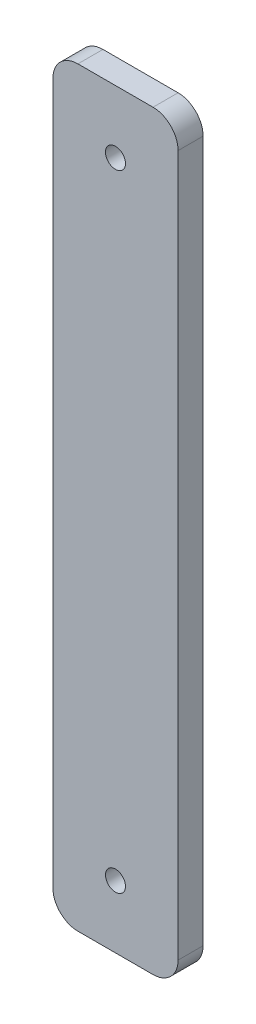
ISO-10303-21;
HEADER;
FILE_DESCRIPTION(('STEP AP214'),'2;1');
FILE_NAME('part.step','',(''),(''),'','','');
FILE_SCHEMA(('AUTOMOTIVE_DESIGN { 1 0 10303 214 1 1 1 1 }'));
ENDSEC;
DATA;
#1=APPLICATION_CONTEXT('core data for automotive mechanical design processes');
#2=APPLICATION_PROTOCOL_DEFINITION('international standard','automotive_design',2000,#1);
#3=PRODUCT_CONTEXT('',#1,'mechanical');
#4=PRODUCT('Part','Part','',(#3));
#5=PRODUCT_RELATED_PRODUCT_CATEGORY('part','',(#4));
#6=PRODUCT_DEFINITION_FORMATION('','',#4);
#7=PRODUCT_DEFINITION_CONTEXT('part definition',#1,'design');
#8=PRODUCT_DEFINITION('design','',#6,#7);
#9=PRODUCT_DEFINITION_SHAPE('','',#8);
#10=(LENGTH_UNIT() NAMED_UNIT(*) SI_UNIT(.MILLI.,.METRE.));
#11=(NAMED_UNIT(*) PLANE_ANGLE_UNIT() SI_UNIT($,.RADIAN.));
#12=(NAMED_UNIT(*) SI_UNIT($,.STERADIAN.) SOLID_ANGLE_UNIT());
#13=UNCERTAINTY_MEASURE_WITH_UNIT(LENGTH_MEASURE(1.E-05),#10,'distance_accuracy_value','');
#14=(GEOMETRIC_REPRESENTATION_CONTEXT(3) GLOBAL_UNCERTAINTY_ASSIGNED_CONTEXT((#13)) GLOBAL_UNIT_ASSIGNED_CONTEXT((#10,
#11,#12)) REPRESENTATION_CONTEXT('',''));
#15=CARTESIAN_POINT('',(0.,0.,0.));
#16=DIRECTION('',(0.,0.,1.));
#17=DIRECTION('',(1.,0.,0.));
#18=AXIS2_PLACEMENT_3D('',#15,#16,#17);
#19=CARTESIAN_POINT('',(0.,0.,10.));
#20=DIRECTION('',(0.,0.,1.));
#21=DIRECTION('',(1.,0.,0.));
#22=AXIS2_PLACEMENT_3D('',#19,#20,#21);
#23=PLANE('',#22);
#24=CARTESIAN_POINT('',(25.,-275.,10.));
#25=DIRECTION('',(0.,0.,1.));
#26=DIRECTION('',(1.,0.,0.));
#27=AXIS2_PLACEMENT_3D('',#24,#25,#26);
#28=CIRCLE('',#27,4.);
#29=CARTESIAN_POINT('',(29.,-275.,10.));
#30=VERTEX_POINT('',#29);
#31=EDGE_CURVE('E178',#30,#30,#28,.T.);
#32=ORIENTED_EDGE('',*,*,#31,.F.);
#33=EDGE_LOOP('',(#32));
#34=FACE_BOUND('',#33,.T.);
#35=DIRECTION('',(1.,0.,0.));
#36=VECTOR('',#35,1.);
#37=CARTESIAN_POINT('',(0.,-300.,10.));
#38=LINE('',#37,#36);
#39=CARTESIAN_POINT('',(10.,-300.,10.));
#40=VERTEX_POINT('',#39);
#41=CARTESIAN_POINT('',(40.,-300.,10.));
#42=VERTEX_POINT('',#41);
#43=EDGE_CURVE('E169',#40,#42,#38,.T.);
#44=ORIENTED_EDGE('',*,*,#43,.T.);
#45=CARTESIAN_POINT('',(40.,-290.,10.));
#46=DIRECTION('',(0.,0.,1.));
#47=DIRECTION('',(1.,0.,0.));
#48=AXIS2_PLACEMENT_3D('',#45,#46,#47);
#49=CIRCLE('',#48,10.);
#50=CARTESIAN_POINT('',(50.,-290.,10.));
#51=VERTEX_POINT('',#50);
#52=EDGE_CURVE('E147',#42,#51,#49,.T.);
#53=ORIENTED_EDGE('',*,*,#52,.T.);
#54=DIRECTION('',(0.,1.,0.));
#55=VECTOR('',#54,1.);
#56=CARTESIAN_POINT('',(50.,0.,10.));
#57=LINE('',#56,#55);
#58=CARTESIAN_POINT('',(50.,-10.,10.));
#59=VERTEX_POINT('',#58);
#60=EDGE_CURVE('E117',#51,#59,#57,.T.);
#61=ORIENTED_EDGE('',*,*,#60,.T.);
#62=CARTESIAN_POINT('',(40.,-10.,10.));
#63=DIRECTION('',(0.,0.,1.));
#64=DIRECTION('',(1.,0.,0.));
#65=AXIS2_PLACEMENT_3D('',#62,#63,#64);
#66=CIRCLE('',#65,10.);
#67=CARTESIAN_POINT('',(40.,0.,10.));
#68=VERTEX_POINT('',#67);
#69=EDGE_CURVE('E53',#59,#68,#66,.T.);
#70=ORIENTED_EDGE('',*,*,#69,.T.);
#71=DIRECTION('',(-1.,0.,0.));
#72=VECTOR('',#71,1.);
#73=CARTESIAN_POINT('',(0.,0.,10.));
#74=LINE('',#73,#72);
#75=CARTESIAN_POINT('',(10.,0.,10.));
#76=VERTEX_POINT('',#75);
#77=EDGE_CURVE('E133',#68,#76,#74,.T.);
#78=ORIENTED_EDGE('',*,*,#77,.T.);
#79=CARTESIAN_POINT('',(10.,-10.,10.));
#80=DIRECTION('',(0.,0.,1.));
#81=DIRECTION('',(1.,0.,0.));
#82=AXIS2_PLACEMENT_3D('',#79,#80,#81);
#83=CIRCLE('',#82,10.);
#84=CARTESIAN_POINT('',(0.,-10.,10.));
#85=VERTEX_POINT('',#84);
#86=EDGE_CURVE('E143',#76,#85,#83,.T.);
#87=ORIENTED_EDGE('',*,*,#86,.T.);
#88=DIRECTION('',(0.,-1.,0.));
#89=VECTOR('',#88,1.);
#90=CARTESIAN_POINT('',(0.,0.,10.));
#91=LINE('',#90,#89);
#92=CARTESIAN_POINT('',(0.,-290.,10.));
#93=VERTEX_POINT('',#92);
#94=EDGE_CURVE('E127',#85,#93,#91,.T.);
#95=ORIENTED_EDGE('',*,*,#94,.T.);
#96=CARTESIAN_POINT('',(10.,-290.,10.));
#97=DIRECTION('',(0.,0.,1.));
#98=DIRECTION('',(1.,0.,0.));
#99=AXIS2_PLACEMENT_3D('',#96,#97,#98);
#100=CIRCLE('',#99,10.);
#101=EDGE_CURVE('E145',#93,#40,#100,.T.);
#102=ORIENTED_EDGE('',*,*,#101,.T.);
#103=EDGE_LOOP('',(#44,#53,#61,#70,#78,#87,#95,#102));
#104=FACE_BOUND('',#103,.T.);
#105=CARTESIAN_POINT('',(25.0000000000001,-25.,10.));
#106=DIRECTION('',(0.,0.,1.));
#107=DIRECTION('',(-1.,0.,0.));
#108=AXIS2_PLACEMENT_3D('',#105,#106,#107);
#109=CIRCLE('',#108,4.);
#110=CARTESIAN_POINT('',(21.0000000000001,-25.,10.));
#111=VERTEX_POINT('',#110);
#112=EDGE_CURVE('E183',#111,#111,#109,.T.);
#113=ORIENTED_EDGE('',*,*,#112,.F.);
#114=EDGE_LOOP('',(#113));
#115=FACE_BOUND('',#114,.T.);
#116=ADVANCED_FACE('F33',(#34,#104,#115),#23,.T.);
#117=CARTESIAN_POINT('',(0.,0.,0.));
#118=DIRECTION('',(0.,0.,1.));
#119=DIRECTION('',(1.,0.,0.));
#120=AXIS2_PLACEMENT_3D('',#117,#118,#119);
#121=PLANE('',#120);
#122=DIRECTION('',(0.,1.,0.));
#123=VECTOR('',#122,1.);
#124=CARTESIAN_POINT('',(50.,0.,0.));
#125=LINE('',#124,#123);
#126=CARTESIAN_POINT('',(50.,-290.,0.));
#127=VERTEX_POINT('',#126);
#128=CARTESIAN_POINT('',(50.,-10.,0.));
#129=VERTEX_POINT('',#128);
#130=EDGE_CURVE('E115',#127,#129,#125,.T.);
#131=ORIENTED_EDGE('',*,*,#130,.F.);
#132=CARTESIAN_POINT('',(40.,-290.,0.));
#133=DIRECTION('',(0.,0.,1.));
#134=DIRECTION('',(1.,0.,0.));
#135=AXIS2_PLACEMENT_3D('',#132,#133,#134);
#136=CIRCLE('',#135,10.);
#137=CARTESIAN_POINT('',(40.,-300.,0.));
#138=VERTEX_POINT('',#137);
#139=EDGE_CURVE('E98',#127,#138,#136,.F.);
#140=ORIENTED_EDGE('',*,*,#139,.T.);
#141=DIRECTION('',(1.,0.,0.));
#142=VECTOR('',#141,1.);
#143=CARTESIAN_POINT('',(0.,-300.,0.));
#144=LINE('',#143,#142);
#145=CARTESIAN_POINT('',(10.,-300.,0.));
#146=VERTEX_POINT('',#145);
#147=EDGE_CURVE('E125',#146,#138,#144,.T.);
#148=ORIENTED_EDGE('',*,*,#147,.F.);
#149=CARTESIAN_POINT('',(10.,-290.,0.));
#150=DIRECTION('',(0.,0.,1.));
#151=DIRECTION('',(1.,0.,0.));
#152=AXIS2_PLACEMENT_3D('',#149,#150,#151);
#153=CIRCLE('',#152,10.);
#154=CARTESIAN_POINT('',(0.,-290.,0.));
#155=VERTEX_POINT('',#154);
#156=EDGE_CURVE('E109',#146,#155,#153,.F.);
#157=ORIENTED_EDGE('',*,*,#156,.T.);
#158=DIRECTION('',(0.,-1.,0.));
#159=VECTOR('',#158,1.);
#160=CARTESIAN_POINT('',(0.,0.,0.));
#161=LINE('',#160,#159);
#162=CARTESIAN_POINT('',(0.,-10.,0.));
#163=VERTEX_POINT('',#162);
#164=EDGE_CURVE('E129',#163,#155,#161,.T.);
#165=ORIENTED_EDGE('',*,*,#164,.F.);
#166=CARTESIAN_POINT('',(10.,-10.,0.));
#167=DIRECTION('',(0.,0.,1.));
#168=DIRECTION('',(1.,0.,0.));
#169=AXIS2_PLACEMENT_3D('',#166,#167,#168);
#170=CIRCLE('',#169,10.);
#171=CARTESIAN_POINT('',(10.,0.,0.));
#172=VERTEX_POINT('',#171);
#173=EDGE_CURVE('E136',#163,#172,#170,.F.);
#174=ORIENTED_EDGE('',*,*,#173,.T.);
#175=DIRECTION('',(-1.,0.,0.));
#176=VECTOR('',#175,1.);
#177=CARTESIAN_POINT('',(0.,0.,0.));
#178=LINE('',#177,#176);
#179=CARTESIAN_POINT('',(40.,0.,0.));
#180=VERTEX_POINT('',#179);
#181=EDGE_CURVE('E124',#180,#172,#178,.T.);
#182=ORIENTED_EDGE('',*,*,#181,.F.);
#183=CARTESIAN_POINT('',(40.,-10.,0.));
#184=DIRECTION('',(0.,0.,1.));
#185=DIRECTION('',(1.,0.,0.));
#186=AXIS2_PLACEMENT_3D('',#183,#184,#185);
#187=CIRCLE('',#186,10.);
#188=EDGE_CURVE('E118',#180,#129,#187,.F.);
#189=ORIENTED_EDGE('',*,*,#188,.T.);
#190=EDGE_LOOP('',(#131,#140,#148,#157,#165,#174,#182,#189));
#191=FACE_BOUND('',#190,.T.);
#192=CARTESIAN_POINT('',(25.,-275.,0.));
#193=DIRECTION('',(0.,0.,1.));
#194=DIRECTION('',(1.,0.,0.));
#195=AXIS2_PLACEMENT_3D('',#192,#193,#194);
#196=CIRCLE('',#195,4.);
#197=CARTESIAN_POINT('',(29.,-275.,0.));
#198=VERTEX_POINT('',#197);
#199=EDGE_CURVE('E174',#198,#198,#196,.T.);
#200=ORIENTED_EDGE('',*,*,#199,.T.);
#201=EDGE_LOOP('',(#200));
#202=FACE_BOUND('',#201,.T.);
#203=CARTESIAN_POINT('',(25.0000000000001,-25.,0.));
#204=DIRECTION('',(0.,0.,1.));
#205=DIRECTION('',(-1.,0.,0.));
#206=AXIS2_PLACEMENT_3D('',#203,#204,#205);
#207=CIRCLE('',#206,4.);
#208=CARTESIAN_POINT('',(21.0000000000001,-25.,0.));
#209=VERTEX_POINT('',#208);
#210=EDGE_CURVE('E185',#209,#209,#207,.T.);
#211=ORIENTED_EDGE('',*,*,#210,.T.);
#212=EDGE_LOOP('',(#211));
#213=FACE_BOUND('',#212,.T.);
#214=ADVANCED_FACE('F121',(#191,#202,#213),#121,.F.);
#215=CARTESIAN_POINT('',(0.,0.,10.));
#216=DIRECTION('',(1.,0.,0.));
#217=DIRECTION('',(0.,0.,-1.));
#218=AXIS2_PLACEMENT_3D('',#215,#216,#217);
#219=PLANE('',#218);
#220=ORIENTED_EDGE('',*,*,#164,.T.);
#221=DIRECTION('',(0.,0.,-1.));
#222=VECTOR('',#221,1.);
#223=CARTESIAN_POINT('',(0.,-290.,10.));
#224=LINE('',#223,#222);
#225=EDGE_CURVE('E152',#155,#93,#224,.F.);
#226=ORIENTED_EDGE('',*,*,#225,.T.);
#227=ORIENTED_EDGE('',*,*,#94,.F.);
#228=DIRECTION('',(0.,0.,-1.));
#229=VECTOR('',#228,1.);
#230=CARTESIAN_POINT('',(0.,-10.,10.));
#231=LINE('',#230,#229);
#232=EDGE_CURVE('E149',#85,#163,#231,.T.);
#233=ORIENTED_EDGE('',*,*,#232,.T.);
#234=EDGE_LOOP('',(#220,#226,#227,#233));
#235=FACE_BOUND('',#234,.T.);
#236=ADVANCED_FACE('F165',(#235),#219,.F.);
#237=CARTESIAN_POINT('',(0.,-300.,10.));
#238=DIRECTION('',(0.,1.,0.));
#239=DIRECTION('',(0.,0.,1.));
#240=AXIS2_PLACEMENT_3D('',#237,#238,#239);
#241=PLANE('',#240);
#242=ORIENTED_EDGE('',*,*,#147,.T.);
#243=DIRECTION('',(0.,0.,-1.));
#244=VECTOR('',#243,1.);
#245=CARTESIAN_POINT('',(40.,-300.,10.));
#246=LINE('',#245,#244);
#247=EDGE_CURVE('E103',#138,#42,#246,.F.);
#248=ORIENTED_EDGE('',*,*,#247,.T.);
#249=ORIENTED_EDGE('',*,*,#43,.F.);
#250=DIRECTION('',(0.,0.,-1.));
#251=VECTOR('',#250,1.);
#252=CARTESIAN_POINT('',(10.,-300.,10.));
#253=LINE('',#252,#251);
#254=EDGE_CURVE('E108',#40,#146,#253,.T.);
#255=ORIENTED_EDGE('',*,*,#254,.T.);
#256=EDGE_LOOP('',(#242,#248,#249,#255));
#257=FACE_BOUND('',#256,.T.);
#258=ADVANCED_FACE('F209',(#257),#241,.F.);
#259=CARTESIAN_POINT('',(50.,0.,10.));
#260=DIRECTION('',(-1.,0.,0.));
#261=DIRECTION('',(0.,0.,1.));
#262=AXIS2_PLACEMENT_3D('',#259,#260,#261);
#263=PLANE('',#262);
#264=ORIENTED_EDGE('',*,*,#60,.F.);
#265=DIRECTION('',(0.,0.,-1.));
#266=VECTOR('',#265,1.);
#267=CARTESIAN_POINT('',(50.,-290.,10.));
#268=LINE('',#267,#266);
#269=EDGE_CURVE('E102',#51,#127,#268,.T.);
#270=ORIENTED_EDGE('',*,*,#269,.T.);
#271=ORIENTED_EDGE('',*,*,#130,.T.);
#272=DIRECTION('',(0.,0.,-1.));
#273=VECTOR('',#272,1.);
#274=CARTESIAN_POINT('',(50.,-10.,10.));
#275=LINE('',#274,#273);
#276=EDGE_CURVE('E119',#129,#59,#275,.F.);
#277=ORIENTED_EDGE('',*,*,#276,.T.);
#278=EDGE_LOOP('',(#264,#270,#271,#277));
#279=FACE_BOUND('',#278,.T.);
#280=ADVANCED_FACE('F114',(#279),#263,.F.);
#281=CARTESIAN_POINT('',(0.,0.,10.));
#282=DIRECTION('',(0.,-1.,0.));
#283=DIRECTION('',(0.,0.,-1.));
#284=AXIS2_PLACEMENT_3D('',#281,#282,#283);
#285=PLANE('',#284);
#286=ORIENTED_EDGE('',*,*,#181,.T.);
#287=DIRECTION('',(0.,0.,-1.));
#288=VECTOR('',#287,1.);
#289=CARTESIAN_POINT('',(10.,0.,10.));
#290=LINE('',#289,#288);
#291=EDGE_CURVE('E11',#172,#76,#290,.F.);
#292=ORIENTED_EDGE('',*,*,#291,.T.);
#293=ORIENTED_EDGE('',*,*,#77,.F.);
#294=DIRECTION('',(0.,0.,-1.));
#295=VECTOR('',#294,1.);
#296=CARTESIAN_POINT('',(40.,0.,10.));
#297=LINE('',#296,#295);
#298=EDGE_CURVE('E41',#68,#180,#297,.T.);
#299=ORIENTED_EDGE('',*,*,#298,.T.);
#300=EDGE_LOOP('',(#286,#292,#293,#299));
#301=FACE_BOUND('',#300,.T.);
#302=ADVANCED_FACE('F155',(#301),#285,.F.);
#303=CARTESIAN_POINT('',(25.,-275.,10.));
#304=DIRECTION('',(0.,0.,-1.));
#305=DIRECTION('',(-1.,0.,0.));
#306=AXIS2_PLACEMENT_3D('',#303,#304,#305);
#307=CYLINDRICAL_SURFACE('',#306,4.);
#308=ORIENTED_EDGE('',*,*,#31,.T.);
#309=EDGE_LOOP('',(#308));
#310=FACE_BOUND('',#309,.T.);
#311=ORIENTED_EDGE('',*,*,#199,.F.);
#312=EDGE_LOOP('',(#311));
#313=FACE_BOUND('',#312,.T.);
#314=ADVANCED_FACE('F202',(#310,#313),#307,.F.);
#315=CARTESIAN_POINT('',(25.0000000000001,-25.,10.));
#316=DIRECTION('',(0.,0.,-1.));
#317=DIRECTION('',(-1.,0.,0.));
#318=AXIS2_PLACEMENT_3D('',#315,#316,#317);
#319=CYLINDRICAL_SURFACE('',#318,4.);
#320=ORIENTED_EDGE('',*,*,#112,.T.);
#321=EDGE_LOOP('',(#320));
#322=FACE_BOUND('',#321,.T.);
#323=ORIENTED_EDGE('',*,*,#210,.F.);
#324=EDGE_LOOP('',(#323));
#325=FACE_BOUND('',#324,.T.);
#326=ADVANCED_FACE('F191',(#322,#325),#319,.F.);
#327=CARTESIAN_POINT('',(40.,-290.,10.));
#328=DIRECTION('',(0.,0.,-1.));
#329=DIRECTION('',(-1.,0.,0.));
#330=AXIS2_PLACEMENT_3D('',#327,#328,#329);
#331=CYLINDRICAL_SURFACE('',#330,10.);
#332=ORIENTED_EDGE('',*,*,#52,.F.);
#333=ORIENTED_EDGE('',*,*,#247,.F.);
#334=ORIENTED_EDGE('',*,*,#139,.F.);
#335=ORIENTED_EDGE('',*,*,#269,.F.);
#336=EDGE_LOOP('',(#332,#333,#334,#335));
#337=FACE_BOUND('',#336,.T.);
#338=ADVANCED_FACE('F101',(#337),#331,.T.);
#339=CARTESIAN_POINT('',(10.,-290.,10.));
#340=DIRECTION('',(0.,0.,-1.));
#341=DIRECTION('',(-1.,0.,0.));
#342=AXIS2_PLACEMENT_3D('',#339,#340,#341);
#343=CYLINDRICAL_SURFACE('',#342,10.);
#344=ORIENTED_EDGE('',*,*,#101,.F.);
#345=ORIENTED_EDGE('',*,*,#225,.F.);
#346=ORIENTED_EDGE('',*,*,#156,.F.);
#347=ORIENTED_EDGE('',*,*,#254,.F.);
#348=EDGE_LOOP('',(#344,#345,#346,#347));
#349=FACE_BOUND('',#348,.T.);
#350=ADVANCED_FACE('F217',(#349),#343,.T.);
#351=CARTESIAN_POINT('',(10.,-10.,10.));
#352=DIRECTION('',(0.,0.,-1.));
#353=DIRECTION('',(-1.,0.,0.));
#354=AXIS2_PLACEMENT_3D('',#351,#352,#353);
#355=CYLINDRICAL_SURFACE('',#354,10.);
#356=ORIENTED_EDGE('',*,*,#86,.F.);
#357=ORIENTED_EDGE('',*,*,#291,.F.);
#358=ORIENTED_EDGE('',*,*,#173,.F.);
#359=ORIENTED_EDGE('',*,*,#232,.F.);
#360=EDGE_LOOP('',(#356,#357,#358,#359));
#361=FACE_BOUND('',#360,.T.);
#362=ADVANCED_FACE('F162',(#361),#355,.T.);
#363=CARTESIAN_POINT('',(40.,-10.,10.));
#364=DIRECTION('',(0.,0.,-1.));
#365=DIRECTION('',(-1.,0.,0.));
#366=AXIS2_PLACEMENT_3D('',#363,#364,#365);
#367=CYLINDRICAL_SURFACE('',#366,10.);
#368=ORIENTED_EDGE('',*,*,#69,.F.);
#369=ORIENTED_EDGE('',*,*,#276,.F.);
#370=ORIENTED_EDGE('',*,*,#188,.F.);
#371=ORIENTED_EDGE('',*,*,#298,.F.);
#372=EDGE_LOOP('',(#368,#369,#370,#371));
#373=FACE_BOUND('',#372,.T.);
#374=ADVANCED_FACE('F35',(#373),#367,.T.);
#375=CLOSED_SHELL('',(#116,#214,#236,#258,#280,#302,#314,#326,#338,#350,#362,#374));
#376=MANIFOLD_SOLID_BREP('B2',#375);
#377=ADVANCED_BREP_SHAPE_REPRESENTATION('',(#18,#376),#14);
#378=SHAPE_DEFINITION_REPRESENTATION(#9,#377);
ENDSEC;
END-ISO-10303-21;
